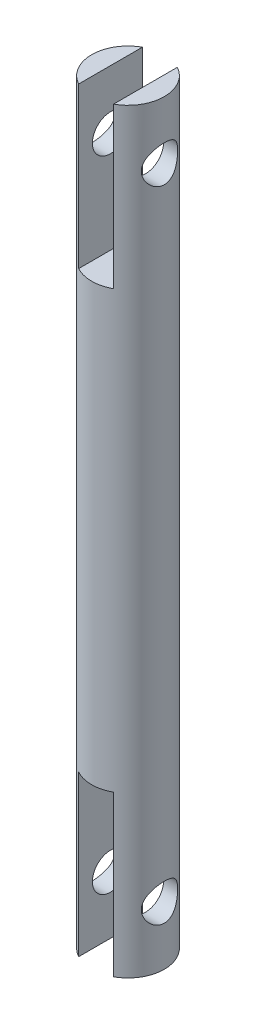
ISO-10303-21;
HEADER;
FILE_DESCRIPTION(('STEP AP214'),'2;1');
FILE_NAME('part.step','',(''),(''),'','','');
FILE_SCHEMA(('AUTOMOTIVE_DESIGN { 1 0 10303 214 1 1 1 1 }'));
ENDSEC;
DATA;
#1=APPLICATION_CONTEXT('core data for automotive mechanical design processes');
#2=APPLICATION_PROTOCOL_DEFINITION('international standard','automotive_design',2000,#1);
#3=PRODUCT_CONTEXT('',#1,'mechanical');
#4=PRODUCT('Part','Part','',(#3));
#5=PRODUCT_RELATED_PRODUCT_CATEGORY('part','',(#4));
#6=PRODUCT_DEFINITION_FORMATION('','',#4);
#7=PRODUCT_DEFINITION_CONTEXT('part definition',#1,'design');
#8=PRODUCT_DEFINITION('design','',#6,#7);
#9=PRODUCT_DEFINITION_SHAPE('','',#8);
#10=(LENGTH_UNIT() NAMED_UNIT(*) SI_UNIT(.MILLI.,.METRE.));
#11=(NAMED_UNIT(*) PLANE_ANGLE_UNIT() SI_UNIT($,.RADIAN.));
#12=(NAMED_UNIT(*) SI_UNIT($,.STERADIAN.) SOLID_ANGLE_UNIT());
#13=UNCERTAINTY_MEASURE_WITH_UNIT(LENGTH_MEASURE(1.E-05),#10,'distance_accuracy_value','');
#14=(GEOMETRIC_REPRESENTATION_CONTEXT(3) GLOBAL_UNCERTAINTY_ASSIGNED_CONTEXT((#13)) GLOBAL_UNIT_ASSIGNED_CONTEXT((#10,
#11,#12)) REPRESENTATION_CONTEXT('',''));
#15=CARTESIAN_POINT('',(0.,0.,0.));
#16=DIRECTION('',(0.,0.,1.));
#17=DIRECTION('',(1.,0.,0.));
#18=AXIS2_PLACEMENT_3D('',#15,#16,#17);
#19=CARTESIAN_POINT('',(0.,52.,0.));
#20=DIRECTION('',(0.,1.,0.));
#21=DIRECTION('',(0.,0.,1.));
#22=AXIS2_PLACEMENT_3D('',#19,#20,#21);
#23=PLANE('',#22);
#24=DIRECTION('',(0.,0.,1.));
#25=VECTOR('',#24,1.);
#26=CARTESIAN_POINT('',(-1.2,52.,-2.5));
#27=LINE('',#26,#25);
#28=CARTESIAN_POINT('',(-1.2,52.,-2.19317121994613));
#29=VERTEX_POINT('',#28);
#30=CARTESIAN_POINT('',(-1.2,52.,2.19317121994613));
#31=VERTEX_POINT('',#30);
#32=EDGE_CURVE('E116',#29,#31,#27,.T.);
#33=ORIENTED_EDGE('',*,*,#32,.F.);
#34=CARTESIAN_POINT('',(0.,52.,0.));
#35=DIRECTION('',(0.,1.,0.));
#36=DIRECTION('',(0.,0.,1.));
#37=AXIS2_PLACEMENT_3D('',#34,#35,#36);
#38=CIRCLE('',#37,2.5);
#39=EDGE_CURVE('E121',#29,#31,#38,.T.);
#40=ORIENTED_EDGE('',*,*,#39,.T.);
#41=EDGE_LOOP('',(#33,#40));
#42=FACE_BOUND('',#41,.T.);
#43=ADVANCED_FACE('F43',(#42),#23,.T.);
#44=CARTESIAN_POINT('',(-2.5,48.,0.));
#45=DIRECTION('',(1.,0.,0.));
#46=DIRECTION('',(0.,0.,-1.));
#47=AXIS2_PLACEMENT_3D('',#44,#45,#46);
#48=CYLINDRICAL_SURFACE('',#47,1.25);
#49=CARTESIAN_POINT('',(-1.2,48.,0.));
#50=DIRECTION('',(-1.,0.,0.));
#51=DIRECTION('',(0.,0.,1.));
#52=AXIS2_PLACEMENT_3D('',#49,#50,#51);
#53=CIRCLE('',#52,1.25);
#54=CARTESIAN_POINT('',(-1.2,48.,1.25));
#55=VERTEX_POINT('',#54);
#56=EDGE_CURVE('E128',#55,#55,#53,.F.);
#57=ORIENTED_EDGE('',*,*,#56,.T.);
#58=EDGE_LOOP('',(#57));
#59=FACE_BOUND('',#58,.T.);
#60=CARTESIAN_POINT('',(-2.5,46.75,0.));
#61=CARTESIAN_POINT('',(-2.49999641755189,46.7500041278994,-0.0657149536912329));
#62=CARTESIAN_POINT('',(-2.49738113774397,46.7552125914021,-0.131508249622541));
#63=CARTESIAN_POINT('',(-2.48717695046745,46.7758161004261,-0.261150294085531));
#64=CARTESIAN_POINT('',(-2.47957859786229,46.7912304912471,-0.324995108391879));
#65=CARTESIAN_POINT('',(-2.46020349254139,46.831492260771,-0.448666931100718));
#66=CARTESIAN_POINT('',(-2.448442989719,46.85630298031,-0.508508503673975));
#67=CARTESIAN_POINT('',(-2.42182220644723,46.9144632767062,-0.623090771008206));
#68=CARTESIAN_POINT('',(-2.40696217041913,46.9478121803111,-0.677831867487562));
#69=CARTESIAN_POINT('',(-2.37445322822571,47.0243965618566,-0.784384772202396));
#70=CARTESIAN_POINT('',(-2.3566899890942,47.0681080990496,-0.835819013902634));
#71=CARTESIAN_POINT('',(-2.32074962808431,47.1631518490588,-0.930974306083716));
#72=CARTESIAN_POINT('',(-2.30257220261294,47.2144898147155,-0.974689478883455));
#73=CARTESIAN_POINT('',(-2.26623688996684,47.3281041869042,-1.05656500056285));
#74=CARTESIAN_POINT('',(-2.24818983712665,47.3909201229324,-1.09403166943955));
#75=CARTESIAN_POINT('',(-2.21607473465401,47.5229591699828,-1.15771028361337));
#76=CARTESIAN_POINT('',(-2.20200384508737,47.5921776609034,-1.18393026870792));
#77=CARTESIAN_POINT('',(-2.18072333797261,47.7308313817774,-1.22266555273573));
#78=CARTESIAN_POINT('',(-2.17315339479642,47.8000055650842,-1.23590732135055));
#79=CARTESIAN_POINT('',(-2.1647736243566,47.9399735472244,-1.25053374163606));
#80=CARTESIAN_POINT('',(-2.1639571167911,48.0107656760889,-1.25193011046634));
#81=CARTESIAN_POINT('',(-2.16888662821561,48.1428575303942,-1.24335910896537));
#82=CARTESIAN_POINT('',(-2.17385954577517,48.2042800390288,-1.23473069942102));
#83=CARTESIAN_POINT('',(-2.18845285917313,48.3246523867163,-1.20867481132116));
#84=CARTESIAN_POINT('',(-2.1980747353972,48.3836014316316,-1.19124452987206));
#85=CARTESIAN_POINT('',(-2.22109345515926,48.4990364157071,-1.1477622254825));
#86=CARTESIAN_POINT('',(-2.23457300829998,48.5554329984822,-1.12151883389499));
#87=CARTESIAN_POINT('',(-2.26379255351755,48.6632928657375,-1.061302109585));
#88=CARTESIAN_POINT('',(-2.27953355975238,48.7147539195001,-1.02732530476558));
#89=CARTESIAN_POINT('',(-2.31391447379107,48.818151565929,-0.947582568640984));
#90=CARTESIAN_POINT('',(-2.33266887795933,48.8693210919702,-0.9008680729616));
#91=CARTESIAN_POINT('',(-2.36934529125509,48.9634192732386,-0.799444473426714));
#92=CARTESIAN_POINT('',(-2.38726689948501,49.0063439900424,-0.744731570717854));
#93=CARTESIAN_POINT('',(-2.42127484103705,49.0846070762872,-0.625645632289809));
#94=CARTESIAN_POINT('',(-2.43723730202509,49.1195005905572,-0.56094198949926));
#95=CARTESIAN_POINT('',(-2.46447351401553,49.1776212863038,-0.425582769360996));
#96=CARTESIAN_POINT('',(-2.47575098679441,49.200857731269,-0.354931970331595));
#97=CARTESIAN_POINT('',(-2.49155417176795,49.2330942546458,-0.215958114575876));
#98=CARTESIAN_POINT('',(-2.4965617287664,49.2431140446835,-0.147926913185405));
#99=CARTESIAN_POINT('',(-2.50091266823877,49.2518309139181,-0.0109744999366913));
#100=CARTESIAN_POINT('',(-2.5002587340164,49.2505333570493,0.0579462748373776));
#101=CARTESIAN_POINT('',(-2.49363990316801,49.2372416394766,0.189041214982493));
#102=CARTESIAN_POINT('',(-2.48809057110237,49.2260843340875,0.251324260062444));
#103=CARTESIAN_POINT('',(-2.47277714143524,49.1947024101311,0.373008615377397));
#104=CARTESIAN_POINT('',(-2.46301257917916,49.1744767919333,0.432409607113746));
#105=CARTESIAN_POINT('',(-2.43980314267087,49.1250019169585,0.548610760562083));
#106=CARTESIAN_POINT('',(-2.42626102212424,49.095511187354,0.605287996257694));
#107=CARTESIAN_POINT('',(-2.39679967896386,49.0286155804424,0.713076702123653));
#108=CARTESIAN_POINT('',(-2.38087944457231,48.9912073317582,0.764185787219102));
#109=CARTESIAN_POINT('',(-2.34635276671831,48.9052994683339,0.864709611613315));
#110=CARTESIAN_POINT('',(-2.32763606060552,48.856071414433,0.913465097280797));
#111=CARTESIAN_POINT('',(-2.29077989504843,48.7500935609134,1.00232040139155));
#112=CARTESIAN_POINT('',(-2.27264084226908,48.6933386014795,1.04241423211355));
#113=CARTESIAN_POINT('',(-2.23813990282585,48.5704454322496,1.11463489312212));
#114=CARTESIAN_POINT('',(-2.2219066207934,48.5039859172393,1.14628186984829));
#115=CARTESIAN_POINT('',(-2.19467590460158,48.3656124153843,1.19760353251725));
#116=CARTESIAN_POINT('',(-2.18367172800773,48.2937055918735,1.21729364485946));
#117=CARTESIAN_POINT('',(-2.16951876260834,48.1538622214232,1.2423271093121));
#118=CARTESIAN_POINT('',(-2.16571729325614,48.0862071832137,1.24886624550108));
#119=CARTESIAN_POINT('',(-2.16456693307719,47.9506911660366,1.25086144297598));
#120=CARTESIAN_POINT('',(-2.16721524534441,47.8828302890757,1.2463223082805));
#121=CARTESIAN_POINT('',(-2.17797327562531,47.755645623085,1.22740765699033));
#122=CARTESIAN_POINT('',(-2.18553868102992,47.6961244123195,1.2140103929285));
#123=CARTESIAN_POINT('',(-2.20463770234897,47.5802398507191,1.1789691977808));
#124=CARTESIAN_POINT('',(-2.21617259462095,47.523877522385,1.15732261394976));
#125=CARTESIAN_POINT('',(-2.2428566295566,47.4117189362667,1.10476968162585));
#126=CARTESIAN_POINT('',(-2.25819652995238,47.3562151227129,1.07333892227057));
#127=CARTESIAN_POINT('',(-2.29044164543238,47.2509068297743,1.00268871454579));
#128=CARTESIAN_POINT('',(-2.30734767243153,47.2011053368519,0.963465214048306));
#129=CARTESIAN_POINT('',(-2.34327903949141,47.102322522053,0.872754158330797));
#130=CARTESIAN_POINT('',(-2.36231229139336,47.0541761220476,0.820355528762708));
#131=CARTESIAN_POINT('',(-2.3984719031886,46.9671712707205,0.707693507775343));
#132=CARTESIAN_POINT('',(-2.4155972326005,46.9283178257171,0.647425904070976));
#133=CARTESIAN_POINT('',(-2.44622511981379,46.8609545465472,0.519914496024928));
#134=CARTESIAN_POINT('',(-2.45970120703636,46.8325197882357,0.452624379918262));
#135=CARTESIAN_POINT('',(-2.48126676704332,46.7877397901013,0.313427626617734));
#136=CARTESIAN_POINT('',(-2.48937154216165,46.771360191463,0.241534749528954));
#137=CARTESIAN_POINT('',(-2.49619327387079,46.7576282361552,0.140752433104227));
#138=CARTESIAN_POINT('',(-2.49761706674002,46.7547716989205,0.112702349299371));
#139=CARTESIAN_POINT('',(-2.49952121222331,46.750956668104,0.0564396647589457));
#140=CARTESIAN_POINT('',(-2.50000153879704,46.749998226911,0.0282270595592261));
#141=CARTESIAN_POINT('',(-2.5,46.75,0.));
#142=B_SPLINE_CURVE_WITH_KNOTS('',3,(#60,#61,#62,#63,#64,#65,#66,#67,#68,#69,#70,#71,#72,#73,
#74,#75,#76,#77,#78,#79,#80,#81,#82,#83,#84,#85,#86,#87,#88,#89,#90,#91,#92,#93,#94,#95,#96,#97,
#98,#99,#100,#101,#102,#103,#104,#105,#106,#107,#108,#109,#110,#111,#112,#113,#114,#115,#116,
#117,#118,#119,#120,#121,#122,#123,#124,#125,#126,#127,#128,#129,#130,#131,#132,#133,#134,#135,
#136,#137,#138,#139,#140,#141),.UNSPECIFIED.,.T.,.F.,(4,2,2,2,2,2,2,2,2,2,2,2,2,2,2,2,2,2,2,2,2,
2,2,2,2,2,2,2,2,2,2,2,2,2,2,2,2,2,2,2,4),(0.,0.197030321775365,0.394435187136497,
0.591077694365375,0.787704700726956,0.9962271983976,1.20490779706754,1.42977158038441,
1.65447434872851,1.86572515175287,2.07676696661275,2.2625714051165,2.44843504907097,
2.63862800210609,2.82890651575277,3.04331176667347,3.25781918248357,3.4822877776805,
3.70657771140349,3.91229113089181,4.11790705639344,4.30758633132651,4.49728652038664,
4.69241070034873,4.88761813435423,5.10199513305522,5.31651985769288,5.54143352699591,
5.76605639925971,5.96911634372966,6.17208824825005,6.35572412805227,6.53941910979597,
6.73545570969517,6.93159451423696,7.15156553440622,7.37165479220715,7.59330017078655,
7.81431135781161,7.8989410017212,7.98357298143557),.UNSPECIFIED.);
#143=CARTESIAN_POINT('',(-2.5,46.75,0.));
#144=VERTEX_POINT('',#143);
#145=EDGE_CURVE('E182',#144,#144,#142,.T.);
#146=ORIENTED_EDGE('',*,*,#145,.F.);
#147=EDGE_LOOP('',(#146));
#148=FACE_BOUND('',#147,.T.);
#149=ADVANCED_FACE('F171',(#59,#148),#48,.F.);
#150=CARTESIAN_POINT('',(0.,52.,0.));
#151=DIRECTION('',(0.,-1.,0.));
#152=DIRECTION('',(0.,0.,-1.));
#153=AXIS2_PLACEMENT_3D('',#150,#151,#152);
#154=CYLINDRICAL_SURFACE('',#153,2.5);
#155=CARTESIAN_POINT('',(0.,41.,0.));
#156=DIRECTION('',(0.,-1.,0.));
#157=DIRECTION('',(0.,0.,-1.));
#158=AXIS2_PLACEMENT_3D('',#155,#156,#157);
#159=CIRCLE('',#158,2.5);
#160=CARTESIAN_POINT('',(1.2,41.,2.19317121994613));
#161=VERTEX_POINT('',#160);
#162=CARTESIAN_POINT('',(-1.2,41.,2.19317121994613));
#163=VERTEX_POINT('',#162);
#164=EDGE_CURVE('E11',#161,#163,#159,.T.);
#165=ORIENTED_EDGE('',*,*,#164,.T.);
#166=DIRECTION('',(0.,-1.,0.));
#167=VECTOR('',#166,1.);
#168=CARTESIAN_POINT('',(-1.2,52.,2.19317121994613));
#169=LINE('',#168,#167);
#170=EDGE_CURVE('E135',#163,#31,#169,.F.);
#171=ORIENTED_EDGE('',*,*,#170,.T.);
#172=ORIENTED_EDGE('',*,*,#39,.F.);
#173=DIRECTION('',(0.,-1.,0.));
#174=VECTOR('',#173,1.);
#175=CARTESIAN_POINT('',(-1.2,52.,-2.19317121994613));
#176=LINE('',#175,#174);
#177=CARTESIAN_POINT('',(-1.2,41.,-2.19317121994613));
#178=VERTEX_POINT('',#177);
#179=EDGE_CURVE('E137',#29,#178,#176,.T.);
#180=ORIENTED_EDGE('',*,*,#179,.T.);
#181=CARTESIAN_POINT('',(1.2,41.,-2.19317121994613));
#182=VERTEX_POINT('',#181);
#183=EDGE_CURVE('E48',#178,#182,#159,.T.);
#184=ORIENTED_EDGE('',*,*,#183,.T.);
#185=DIRECTION('',(0.,-1.,0.));
#186=VECTOR('',#185,1.);
#187=CARTESIAN_POINT('',(1.2,52.,-2.19317121994613));
#188=LINE('',#187,#186);
#189=CARTESIAN_POINT('',(1.2,52.,-2.19317121994613));
#190=VERTEX_POINT('',#189);
#191=EDGE_CURVE('E110',#182,#190,#188,.F.);
#192=ORIENTED_EDGE('',*,*,#191,.T.);
#193=CARTESIAN_POINT('',(1.2,52.,2.19317121994613));
#194=VERTEX_POINT('',#193);
#195=EDGE_CURVE('E118',#194,#190,#38,.T.);
#196=ORIENTED_EDGE('',*,*,#195,.F.);
#197=DIRECTION('',(0.,-1.,0.));
#198=VECTOR('',#197,1.);
#199=CARTESIAN_POINT('',(1.2,52.,2.19317121994613));
#200=LINE('',#199,#198);
#201=EDGE_CURVE('E113',#194,#161,#200,.T.);
#202=ORIENTED_EDGE('',*,*,#201,.T.);
#203=EDGE_LOOP('',(#165,#171,#172,#180,#184,#192,#196,#202));
#204=FACE_BOUND('',#203,.T.);
#205=CARTESIAN_POINT('',(-2.5,2.75,0.));
#206=CARTESIAN_POINT('',(-2.49999641755189,2.75000412789938,-0.0657149536912331));
#207=CARTESIAN_POINT('',(-2.49738113774397,2.75521259140209,-0.131508249622541));
#208=CARTESIAN_POINT('',(-2.48717695046745,2.77581610042615,-0.261150294085532));
#209=CARTESIAN_POINT('',(-2.47957859786229,2.79123049124706,-0.32499510839188));
#210=CARTESIAN_POINT('',(-2.46020349254139,2.83149226077099,-0.448666931100718));
#211=CARTESIAN_POINT('',(-2.448442989719,2.85630298031002,-0.508508503673975));
#212=CARTESIAN_POINT('',(-2.42182220644723,2.91446327670618,-0.623090771008207));
#213=CARTESIAN_POINT('',(-2.40696217041912,2.94781218031107,-0.677831867487563));
#214=CARTESIAN_POINT('',(-2.37445322822571,3.02439656185662,-0.784384772202399));
#215=CARTESIAN_POINT('',(-2.3566899890942,3.06810809904955,-0.835819013902641));
#216=CARTESIAN_POINT('',(-2.3207496280843,3.16315184905879,-0.930974306083722));
#217=CARTESIAN_POINT('',(-2.30257220261294,3.21448981471555,-0.974689478883458));
#218=CARTESIAN_POINT('',(-2.26623688996684,3.32810418690423,-1.05656500056285));
#219=CARTESIAN_POINT('',(-2.24818983712665,3.39092012293239,-1.09403166943955));
#220=CARTESIAN_POINT('',(-2.21607473465401,3.52295916998277,-1.15771028361337));
#221=CARTESIAN_POINT('',(-2.20200384508737,3.59217766090344,-1.18393026870792));
#222=CARTESIAN_POINT('',(-2.18072333797261,3.7308313817774,-1.22266555273573));
#223=CARTESIAN_POINT('',(-2.17315339479642,3.80000556508424,-1.23590732135055));
#224=CARTESIAN_POINT('',(-2.1647736243566,3.93997354722434,-1.25053374163606));
#225=CARTESIAN_POINT('',(-2.1639571167911,4.01076567608894,-1.25193011046634));
#226=CARTESIAN_POINT('',(-2.16888662821561,4.14285753039421,-1.24335910896537));
#227=CARTESIAN_POINT('',(-2.17385954577517,4.20428003902881,-1.23473069942103));
#228=CARTESIAN_POINT('',(-2.18845285917313,4.3246523867163,-1.20867481132117));
#229=CARTESIAN_POINT('',(-2.1980747353972,4.38360143163164,-1.19124452987206));
#230=CARTESIAN_POINT('',(-2.22109345515926,4.49903641570707,-1.1477622254825));
#231=CARTESIAN_POINT('',(-2.23457300829998,4.55543299848223,-1.12151883389499));
#232=CARTESIAN_POINT('',(-2.26379255351755,4.66329286573751,-1.061302109585));
#233=CARTESIAN_POINT('',(-2.27953355975238,4.71475391950011,-1.02732530476558));
#234=CARTESIAN_POINT('',(-2.31391447379107,4.81815156592903,-0.947582568640986));
#235=CARTESIAN_POINT('',(-2.33266887795933,4.8693210919702,-0.900868072961602));
#236=CARTESIAN_POINT('',(-2.36934529125509,4.96341927323863,-0.799444473426716));
#237=CARTESIAN_POINT('',(-2.38726689948501,5.00634399004235,-0.744731570717856));
#238=CARTESIAN_POINT('',(-2.42127484103705,5.08460707628716,-0.625645632289809));
#239=CARTESIAN_POINT('',(-2.43723730202509,5.11950059055718,-0.56094198949926));
#240=CARTESIAN_POINT('',(-2.46447351401553,5.17762128630376,-0.425582769360995));
#241=CARTESIAN_POINT('',(-2.47575098679441,5.20085773126896,-0.354931970331594));
#242=CARTESIAN_POINT('',(-2.49155417176795,5.23309425464584,-0.215958114575876));
#243=CARTESIAN_POINT('',(-2.4965617287664,5.24311404468347,-0.147926913185404));
#244=CARTESIAN_POINT('',(-2.50091266823877,5.25183091391811,-0.0109744999366911));
#245=CARTESIAN_POINT('',(-2.5002587340164,5.25053335704935,0.0579462748373775));
#246=CARTESIAN_POINT('',(-2.49363990316801,5.23724163947656,0.189041214982492));
#247=CARTESIAN_POINT('',(-2.48809057110237,5.22608433408746,0.251324260062443));
#248=CARTESIAN_POINT('',(-2.47277714143524,5.19470241013114,0.373008615377396));
#249=CARTESIAN_POINT('',(-2.46301257917916,5.1744767919333,0.432409607113746));
#250=CARTESIAN_POINT('',(-2.43980314267087,5.12500191695853,0.548610760562081));
#251=CARTESIAN_POINT('',(-2.42626102212424,5.09551118735398,0.605287996257691));
#252=CARTESIAN_POINT('',(-2.39679967896386,5.02861558044245,0.71307670212365));
#253=CARTESIAN_POINT('',(-2.38087944457231,4.99120733175821,0.764185787219102));
#254=CARTESIAN_POINT('',(-2.34635276671831,4.90529946833391,0.864709611613316));
#255=CARTESIAN_POINT('',(-2.32763606060552,4.85607141443304,0.913465097280798));
#256=CARTESIAN_POINT('',(-2.29077989504843,4.75009356091337,1.00232040139155));
#257=CARTESIAN_POINT('',(-2.27264084226908,4.69333860147953,1.04241423211355));
#258=CARTESIAN_POINT('',(-2.23813990282585,4.57044543224961,1.11463489312212));
#259=CARTESIAN_POINT('',(-2.2219066207934,4.50398591723926,1.1462818698483));
#260=CARTESIAN_POINT('',(-2.19467590460158,4.36561241538435,1.19760353251725));
#261=CARTESIAN_POINT('',(-2.18367172800773,4.29370559187352,1.21729364485946));
#262=CARTESIAN_POINT('',(-2.16951876260833,4.15386222142319,1.2423271093121));
#263=CARTESIAN_POINT('',(-2.16571729325614,4.0862071832137,1.24886624550108));
#264=CARTESIAN_POINT('',(-2.16456693307719,3.95069116603659,1.25086144297598));
#265=CARTESIAN_POINT('',(-2.16721524534441,3.88283028907571,1.2463223082805));
#266=CARTESIAN_POINT('',(-2.17797327562531,3.75564562308498,1.22740765699033));
#267=CARTESIAN_POINT('',(-2.18553868102992,3.6961244123195,1.2140103929285));
#268=CARTESIAN_POINT('',(-2.20463770234897,3.58023985071912,1.17896919778081));
#269=CARTESIAN_POINT('',(-2.21617259462095,3.52387752238504,1.15732261394976));
#270=CARTESIAN_POINT('',(-2.2428566295566,3.41171893626674,1.10476968162585));
#271=CARTESIAN_POINT('',(-2.25819652995238,3.35621512271287,1.07333892227057));
#272=CARTESIAN_POINT('',(-2.29044164543238,3.25090682977427,1.00268871454579));
#273=CARTESIAN_POINT('',(-2.30734767243153,3.20110533685189,0.963465214048309));
#274=CARTESIAN_POINT('',(-2.34327903949141,3.10232252205298,0.8727541583308));
#275=CARTESIAN_POINT('',(-2.36231229139336,3.0541761220476,0.820355528762712));
#276=CARTESIAN_POINT('',(-2.3984719031886,2.96717127072046,0.707693507775348));
#277=CARTESIAN_POINT('',(-2.4155972326005,2.92831782571714,0.64742590407098));
#278=CARTESIAN_POINT('',(-2.44622511981379,2.86095454654725,0.519914496024933));
#279=CARTESIAN_POINT('',(-2.45970120703636,2.83251978823571,0.452624379918268));
#280=CARTESIAN_POINT('',(-2.48126676704332,2.78773979010131,0.313427626617739));
#281=CARTESIAN_POINT('',(-2.48937154216165,2.77136019146303,0.241534749528957));
#282=CARTESIAN_POINT('',(-2.49619327387079,2.75762823615519,0.140752433104229));
#283=CARTESIAN_POINT('',(-2.49761706674002,2.75477169892048,0.112702349299373));
#284=CARTESIAN_POINT('',(-2.49952121222331,2.75095666810399,0.0564396647589469));
#285=CARTESIAN_POINT('',(-2.50000153879704,2.749998226911,0.0282270595592267));
#286=CARTESIAN_POINT('',(-2.5,2.75,0.));
#287=B_SPLINE_CURVE_WITH_KNOTS('',3,(#205,#206,#207,#208,#209,#210,#211,#212,#213,#214,#215,
#216,#217,#218,#219,#220,#221,#222,#223,#224,#225,#226,#227,#228,#229,#230,#231,#232,#233,#234,
#235,#236,#237,#238,#239,#240,#241,#242,#243,#244,#245,#246,#247,#248,#249,#250,#251,#252,#253,
#254,#255,#256,#257,#258,#259,#260,#261,#262,#263,#264,#265,#266,#267,#268,#269,#270,#271,#272,
#273,#274,#275,#276,#277,#278,#279,#280,#281,#282,#283,#284,#285,#286),.UNSPECIFIED.,.T.,.F.,(4,
2,2,2,2,2,2,2,2,2,2,2,2,2,2,2,2,2,2,2,2,2,2,2,2,2,2,2,2,2,2,2,2,2,2,2,2,2,2,2,4),(0.,
0.197030321775366,0.394435187136497,0.591077694365373,0.78770470072696,0.996227198397612,
1.20490779706755,1.42977158038441,1.65447434872851,1.86572515175287,2.07676696661275,
2.2625714051165,2.44843504907098,2.63862800210609,2.82890651575277,3.04331176667348,
3.25781918248358,3.48228777768051,3.70657771140349,3.91229113089182,4.11790705639345,
4.30758633132652,4.49728652038664,4.69241070034873,4.88761813435424,5.10199513305523,
5.31651985769289,5.54143352699592,5.76605639925972,5.96911634372967,6.17208824825007,
6.35572412805228,6.53941910979597,6.73545570969517,6.93159451423697,7.15156553440623,
7.37165479220716,7.59330017078656,7.81431135781162,7.89894100172122,7.98357298143558),.UNSPECIFIED.);
#288=CARTESIAN_POINT('',(-2.5,2.75,0.));
#289=VERTEX_POINT('',#288);
#290=EDGE_CURVE('E150',#289,#289,#287,.T.);
#291=ORIENTED_EDGE('',*,*,#290,.T.);
#292=EDGE_LOOP('',(#291));
#293=FACE_BOUND('',#292,.T.);
#294=CARTESIAN_POINT('',(2.1650635094611,4.,-1.25));
#295=CARTESIAN_POINT('',(2.16506918410574,3.93486523975594,-1.24999545384316));
#296=CARTESIAN_POINT('',(2.16804751484696,3.86964823559369,-1.24487496341652));
#297=CARTESIAN_POINT('',(2.17952958065066,3.74121591915356,-1.22465401237257));
#298=CARTESIAN_POINT('',(2.18804492569449,3.67800510619574,-1.20953258069272));
#299=CARTESIAN_POINT('',(2.20936683256748,3.55568541957007,-1.17012493587476));
#300=CARTESIAN_POINT('',(2.22215054341565,3.49655668440802,-1.14588744061716));
#301=CARTESIAN_POINT('',(2.25053331021072,3.3832197475041,-1.08908440672047));
#302=CARTESIAN_POINT('',(2.26613251845081,3.32901181217193,-1.05651841754472));
#303=CARTESIAN_POINT('',(2.29996086321802,3.22211783930312,-0.980833175663599));
#304=CARTESIAN_POINT('',(2.31830079547442,3.16992608040807,-0.937065045179714));
#305=CARTESIAN_POINT('',(2.35464978482132,3.07323951449162,-0.841567259518087));
#306=CARTESIAN_POINT('',(2.37265867289062,3.0287485467706,-0.789833657227868));
#307=CARTESIAN_POINT('',(2.40776846191186,2.94579106106542,-0.675611954268185));
#308=CARTESIAN_POINT('',(2.42472633022716,2.90793279017559,-0.612633986265721));
#309=CARTESIAN_POINT('',(2.45438445124411,2.8435739334428,-0.480196283249383));
#310=CARTESIAN_POINT('',(2.46708738979677,2.81706617982854,-0.410740672672698));
#311=CARTESIAN_POINT('',(2.48600576555297,2.77811917337363,-0.272556179907475));
#312=CARTESIAN_POINT('',(2.49261850276115,2.76481309205559,-0.204127238111026));
#313=CARTESIAN_POINT('',(2.50009479807584,2.7497923516562,-0.0657132858723139));
#314=CARTESIAN_POINT('',(2.50096183480737,2.74807067900536,0.00427075730466945));
#315=CARTESIAN_POINT('',(2.49703727395563,2.75593334246294,0.137290655529684));
#316=CARTESIAN_POINT('',(2.49273119865201,2.76454751940153,0.200401498970986));
#317=CARTESIAN_POINT('',(2.47967806574684,2.79110105488082,0.3241422148979));
#318=CARTESIAN_POINT('',(2.47093067582992,2.80904111122028,0.384771901367404));
#319=CARTESIAN_POINT('',(2.44964479109568,2.85385320761227,0.50288673946194));
#320=CARTESIAN_POINT('',(2.43705551911499,2.88084539146508,0.560316779393971));
#321=CARTESIAN_POINT('',(2.40922057483359,2.94282927025187,0.669971001891658));
#322=CARTESIAN_POINT('',(2.39397395196855,2.97782382912794,0.722193311048305));
#323=CARTESIAN_POINT('',(2.36055492999037,3.05861918941627,0.825217076122742));
#324=CARTESIAN_POINT('',(2.34224219997719,3.10512878540751,0.875417593786699));
#325=CARTESIAN_POINT('',(2.30567925733515,3.20573715616272,0.967630462872223));
#326=CARTESIAN_POINT('',(2.28742910332036,3.25984171534258,1.00963651446779));
#327=CARTESIAN_POINT('',(2.25180195115606,3.37831024053011,1.08688166830276));
#328=CARTESIAN_POINT('',(2.23455399988385,3.44310752881776,1.12152164372256));
#329=CARTESIAN_POINT('',(2.2046931284822,3.57867208919875,1.17914889125154));
#330=CARTESIAN_POINT('',(2.19207537557584,3.64943304127195,1.20214832276361));
#331=CARTESIAN_POINT('',(2.17430794771293,3.78901813910349,1.2339752637813));
#332=CARTESIAN_POINT('',(2.16864569810621,3.85755139880444,1.24378140264997));
#333=CARTESIAN_POINT('',(2.16397399202012,3.99550167689567,1.25189618326428));
#334=CARTESIAN_POINT('',(2.1649598361164,4.06491803639973,1.25021294664378));
#335=CARTESIAN_POINT('',(2.17292920675731,4.19456739822341,1.23629505417996));
#336=CARTESIAN_POINT('',(2.17924484383318,4.2549743138849,1.22523477089058));
#337=CARTESIAN_POINT('',(2.19617526939176,4.37295973283869,1.19462035579055));
#338=CARTESIAN_POINT('',(2.20679145006292,4.43053731343326,1.17506347327952));
#339=CARTESIAN_POINT('',(2.23170277599571,4.54426416362837,1.12705948575611));
#340=CARTESIAN_POINT('',(2.24614554053829,4.60022377106694,1.09824257961591));
#341=CARTESIAN_POINT('',(2.27695149371562,4.70683658942374,1.03285883001976));
#342=CARTESIAN_POINT('',(2.29331566693934,4.7574870543916,0.996288005415272));
#343=CARTESIAN_POINT('',(2.3285999807042,4.85872345940443,0.911046458998569));
#344=CARTESIAN_POINT('',(2.34758228942861,4.90849643839707,0.86143159039371));
#345=CARTESIAN_POINT('',(2.38417793722366,4.99926529749199,0.754255619247862));
#346=CARTESIAN_POINT('',(2.40179081259637,5.04025821278817,0.696691843319186));
#347=CARTESIAN_POINT('',(2.43426702113696,5.11321715743763,0.573169203198449));
#348=CARTESIAN_POINT('',(2.44904552090036,5.14491639776364,0.507028871967643));
#349=CARTESIAN_POINT('',(2.47354193699126,5.19642237982174,0.369402955801354));
#350=CARTESIAN_POINT('',(2.48326429595466,5.21623956420788,0.297922126740222));
#351=CARTESIAN_POINT('',(2.49584385227353,5.24171070521833,0.158724602913023));
#352=CARTESIAN_POINT('',(2.49924909885239,5.24849734484514,0.0912643048130729));
#353=CARTESIAN_POINT('',(2.50052662968914,5.251054081818,-0.0439074824390028));
#354=CARTESIAN_POINT('',(2.49840085083612,5.24682803565445,-0.111618875368857));
#355=CARTESIAN_POINT('',(2.48917461047403,5.22822949150547,-0.240672490396432));
#356=CARTESIAN_POINT('',(2.48241118334987,5.21454393842791,-0.302140397264078));
#357=CARTESIAN_POINT('',(2.46490117079279,5.17834125087129,-0.42180744022952));
#358=CARTESIAN_POINT('',(2.45415401415995,5.15582284988318,-0.480006106194384));
#359=CARTESIAN_POINT('',(2.4290741343515,5.10159118479253,-0.594279257806103));
#360=CARTESIAN_POINT('',(2.41460771498499,5.0695258459902,-0.650156428375055));
#361=CARTESIAN_POINT('',(2.38360166427283,4.99755258642619,-0.755968302267528));
#362=CARTESIAN_POINT('',(2.36706108197951,4.95764106360541,-0.805900259268631));
#363=CARTESIAN_POINT('',(2.33160762783285,4.86650357622162,-0.903642505196111));
#364=CARTESIAN_POINT('',(2.31262248764623,4.81454689065351,-0.950747105674087));
#365=CARTESIAN_POINT('',(2.27578845203566,4.70318659858779,-1.03582910924334));
#366=CARTESIAN_POINT('',(2.25794057202332,4.6437764739154,-1.07379843751257));
#367=CARTESIAN_POINT('',(2.22499506631145,4.51670419177381,-1.14053884973207));
#368=CARTESIAN_POINT('',(2.21000217820338,4.44884058608908,-1.16898133245117));
#369=CARTESIAN_POINT('',(2.1858269541044,4.30833449457528,-1.21359838688301));
#370=CARTESIAN_POINT('',(2.17662520184628,4.23570888885914,-1.22981398896918));
#371=CARTESIAN_POINT('',(2.16911590752238,4.13524330543501,-1.24295875983052));
#372=CARTESIAN_POINT('',(2.1676016125644,4.10829013200265,-1.24559513120481));
#373=CARTESIAN_POINT('',(2.16557419859688,4.0542293991472,-1.24911675636245));
#374=CARTESIAN_POINT('',(2.16506114656387,4.02712182951766,-1.25000189299984));
#375=CARTESIAN_POINT('',(2.1650635094611,4.,-1.25));
#376=B_SPLINE_CURVE_WITH_KNOTS('',3,(#294,#295,#296,#297,#298,#299,#300,#301,#302,#303,#304,
#305,#306,#307,#308,#309,#310,#311,#312,#313,#314,#315,#316,#317,#318,#319,#320,#321,#322,#323,
#324,#325,#326,#327,#328,#329,#330,#331,#332,#333,#334,#335,#336,#337,#338,#339,#340,#341,#342,
#343,#344,#345,#346,#347,#348,#349,#350,#351,#352,#353,#354,#355,#356,#357,#358,#359,#360,#361,
#362,#363,#364,#365,#366,#367,#368,#369,#370,#371,#372,#373,#374,#375),.UNSPECIFIED.,.T.,.F.,(4,
2,2,2,2,2,2,2,2,2,2,2,2,2,2,2,2,2,2,2,2,2,2,2,2,2,2,2,2,2,2,2,2,2,2,2,2,2,2,2,4),(0.,
0.195290153243394,0.390991116031005,0.585660744898606,0.780340906806435,0.991077890622789,
1.20191963855463,1.42697365298454,1.65188533704863,1.86079356209918,2.0695752960755,
2.26020121855672,2.45084140646818,2.64411918413933,2.83746624187839,3.04908989321113,
3.26087560307398,3.4861105216181,3.71110967764631,3.91827863567764,4.12530116485466,
4.30967729280031,4.49411315545078,4.68709120507609,4.88016857775058,5.09758429475766,
5.31507331222752,5.53830226766206,5.76133474760964,5.96390337986858,6.16640108492464,
6.35555531089365,6.54473666890015,6.74200938399339,6.93937287625898,7.15637802312583,
7.37357428556442,7.59763436298255,7.8209391625345,7.90225168981636,7.98356965618175),.UNSPECIFIED.);
#377=CARTESIAN_POINT('',(2.1650635094611,4.,-1.25));
#378=VERTEX_POINT('',#377);
#379=EDGE_CURVE('E143',#378,#378,#376,.T.);
#380=ORIENTED_EDGE('',*,*,#379,.T.);
#381=EDGE_LOOP('',(#380));
#382=FACE_BOUND('',#381,.T.);
#383=ORIENTED_EDGE('',*,*,#145,.T.);
#384=EDGE_LOOP('',(#383));
#385=FACE_BOUND('',#384,.T.);
#386=CARTESIAN_POINT('',(2.1650635094611,48.,-1.25));
#387=CARTESIAN_POINT('',(2.16506918410574,47.9348652397559,-1.24999545384316));
#388=CARTESIAN_POINT('',(2.16804751484696,47.8696482355937,-1.24487496341652));
#389=CARTESIAN_POINT('',(2.17952958065066,47.7412159191536,-1.22465401237257));
#390=CARTESIAN_POINT('',(2.18804492569449,47.6780051061957,-1.20953258069272));
#391=CARTESIAN_POINT('',(2.20936683256748,47.5556854195701,-1.17012493587476));
#392=CARTESIAN_POINT('',(2.22215054341565,47.496556684408,-1.14588744061716));
#393=CARTESIAN_POINT('',(2.25053331021072,47.3832197475041,-1.08908440672046));
#394=CARTESIAN_POINT('',(2.26613251845081,47.3290118121719,-1.05651841754471));
#395=CARTESIAN_POINT('',(2.29996086321802,47.2221178393031,-0.980833175663595));
#396=CARTESIAN_POINT('',(2.31830079547442,47.1699260804081,-0.93706504517971));
#397=CARTESIAN_POINT('',(2.35464978482132,47.0732395144916,-0.841567259518083));
#398=CARTESIAN_POINT('',(2.37265867289062,47.0287485467706,-0.789833657227865));
#399=CARTESIAN_POINT('',(2.40776846191186,46.9457910610654,-0.675611954268183));
#400=CARTESIAN_POINT('',(2.42472633022716,46.9079327901756,-0.61263398626572));
#401=CARTESIAN_POINT('',(2.45438445124411,46.8435739334428,-0.480196283249383));
#402=CARTESIAN_POINT('',(2.46708738979677,46.8170661798285,-0.410740672672697));
#403=CARTESIAN_POINT('',(2.48600576555297,46.7781191733736,-0.272556179907475));
#404=CARTESIAN_POINT('',(2.49261850276115,46.7648130920556,-0.204127238111025));
#405=CARTESIAN_POINT('',(2.50009479807584,46.7497923516562,-0.0657132858723139));
#406=CARTESIAN_POINT('',(2.50096183480737,46.7480706790054,0.00427075730466915));
#407=CARTESIAN_POINT('',(2.49703727395563,46.7559333424629,0.137290655529684));
#408=CARTESIAN_POINT('',(2.49273119865201,46.7645475194015,0.200401498970986));
#409=CARTESIAN_POINT('',(2.47967806574684,46.7911010548808,0.3241422148979));
#410=CARTESIAN_POINT('',(2.47093067582992,46.8090411112203,0.384771901367404));
#411=CARTESIAN_POINT('',(2.44964479109568,46.8538532076123,0.502886739461939));
#412=CARTESIAN_POINT('',(2.43705551911499,46.8808453914651,0.56031677939397));
#413=CARTESIAN_POINT('',(2.40922057483359,46.9428292702519,0.669971001891658));
#414=CARTESIAN_POINT('',(2.39397395196855,46.9778238291279,0.722193311048306));
#415=CARTESIAN_POINT('',(2.36055492999037,47.0586191894163,0.825217076122743));
#416=CARTESIAN_POINT('',(2.34224219997719,47.1051287854075,0.875417593786699));
#417=CARTESIAN_POINT('',(2.30567925733515,47.2057371561627,0.967630462872223));
#418=CARTESIAN_POINT('',(2.28742910332036,47.2598417153426,1.00963651446779));
#419=CARTESIAN_POINT('',(2.25180195115606,47.3783102405301,1.08688166830276));
#420=CARTESIAN_POINT('',(2.23455399988384,47.4431075288178,1.12152164372256));
#421=CARTESIAN_POINT('',(2.2046931284822,47.5786720891987,1.17914889125154));
#422=CARTESIAN_POINT('',(2.19207537557584,47.649433041272,1.20214832276361));
#423=CARTESIAN_POINT('',(2.17430794771293,47.7890181391035,1.2339752637813));
#424=CARTESIAN_POINT('',(2.16864569810621,47.8575513988044,1.24378140264997));
#425=CARTESIAN_POINT('',(2.16397399202012,47.9955016768957,1.25189618326428));
#426=CARTESIAN_POINT('',(2.1649598361164,48.0649180363997,1.25021294664378));
#427=CARTESIAN_POINT('',(2.17292920675731,48.1945673982234,1.23629505417996));
#428=CARTESIAN_POINT('',(2.17924484383318,48.2549743138849,1.22523477089058));
#429=CARTESIAN_POINT('',(2.19617526939176,48.3729597328387,1.19462035579055));
#430=CARTESIAN_POINT('',(2.20679145006292,48.4305373134333,1.17506347327952));
#431=CARTESIAN_POINT('',(2.23170277599571,48.5442641636284,1.12705948575611));
#432=CARTESIAN_POINT('',(2.24614554053829,48.6002237710669,1.0982425796159));
#433=CARTESIAN_POINT('',(2.27695149371562,48.7068365894237,1.03285883001976));
#434=CARTESIAN_POINT('',(2.29331566693934,48.7574870543916,0.996288005415271));
#435=CARTESIAN_POINT('',(2.3285999807042,48.8587234594044,0.911046458998568));
#436=CARTESIAN_POINT('',(2.34758228942861,48.9084964383971,0.86143159039371));
#437=CARTESIAN_POINT('',(2.38417793722365,48.999265297492,0.754255619247864));
#438=CARTESIAN_POINT('',(2.40179081259636,49.0402582127882,0.696691843319187));
#439=CARTESIAN_POINT('',(2.43426702113696,49.1132171574376,0.57316920319845));
#440=CARTESIAN_POINT('',(2.44904552090036,49.1449163977636,0.507028871967644));
#441=CARTESIAN_POINT('',(2.47354193699126,49.1964223798217,0.369402955801354));
#442=CARTESIAN_POINT('',(2.48326429595466,49.2162395642079,0.29792212674022));
#443=CARTESIAN_POINT('',(2.49584385227353,49.2417107052183,0.158724602913021));
#444=CARTESIAN_POINT('',(2.49924909885239,49.2484973448451,0.0912643048130715));
#445=CARTESIAN_POINT('',(2.50052662968914,49.251054081818,-0.0439074824390033));
#446=CARTESIAN_POINT('',(2.49840085083612,49.2468280356545,-0.111618875368857));
#447=CARTESIAN_POINT('',(2.48917461047403,49.2282294915055,-0.240672490396431));
#448=CARTESIAN_POINT('',(2.48241118334987,49.2145439384279,-0.302140397264077));
#449=CARTESIAN_POINT('',(2.46490117079279,49.1783412508713,-0.421807440229519));
#450=CARTESIAN_POINT('',(2.45415401415995,49.1558228498832,-0.480006106194384));
#451=CARTESIAN_POINT('',(2.4290741343515,49.1015911847925,-0.594279257806104));
#452=CARTESIAN_POINT('',(2.41460771498499,49.0695258459902,-0.650156428375056));
#453=CARTESIAN_POINT('',(2.38360166427283,48.9975525864262,-0.75596830226753));
#454=CARTESIAN_POINT('',(2.36706108197951,48.9576410636054,-0.805900259268633));
#455=CARTESIAN_POINT('',(2.33160762783285,48.8665035762216,-0.903642505196114));
#456=CARTESIAN_POINT('',(2.31262248764622,48.8145468906535,-0.95074710567409));
#457=CARTESIAN_POINT('',(2.27578845203565,48.7031865985878,-1.03582910924334));
#458=CARTESIAN_POINT('',(2.25794057202332,48.6437764739154,-1.07379843751257));
#459=CARTESIAN_POINT('',(2.22499506631145,48.5167041917738,-1.14053884973207));
#460=CARTESIAN_POINT('',(2.21000217820338,48.4488405860891,-1.16898133245117));
#461=CARTESIAN_POINT('',(2.1858269541044,48.3083344945753,-1.21359838688301));
#462=CARTESIAN_POINT('',(2.17662520184628,48.2357088888591,-1.22981398896918));
#463=CARTESIAN_POINT('',(2.16911590752238,48.135243305435,-1.24295875983052));
#464=CARTESIAN_POINT('',(2.1676016125644,48.1082901320026,-1.24559513120481));
#465=CARTESIAN_POINT('',(2.16557419859688,48.0542293991472,-1.24911675636245));
#466=CARTESIAN_POINT('',(2.16506114656387,48.0271218295177,-1.25000189299984));
#467=CARTESIAN_POINT('',(2.1650635094611,48.,-1.25));
#468=B_SPLINE_CURVE_WITH_KNOTS('',3,(#386,#387,#388,#389,#390,#391,#392,#393,#394,#395,#396,
#397,#398,#399,#400,#401,#402,#403,#404,#405,#406,#407,#408,#409,#410,#411,#412,#413,#414,#415,
#416,#417,#418,#419,#420,#421,#422,#423,#424,#425,#426,#427,#428,#429,#430,#431,#432,#433,#434,
#435,#436,#437,#438,#439,#440,#441,#442,#443,#444,#445,#446,#447,#448,#449,#450,#451,#452,#453,
#454,#455,#456,#457,#458,#459,#460,#461,#462,#463,#464,#465,#466,#467),.UNSPECIFIED.,.T.,.F.,(4,
2,2,2,2,2,2,2,2,2,2,2,2,2,2,2,2,2,2,2,2,2,2,2,2,2,2,2,2,2,2,2,2,2,2,2,2,2,2,2,4),(0.,
0.195290153243387,0.390991116031004,0.585660744898612,0.780340906806441,0.991077890622794,
1.20191963855463,1.42697365298454,1.65188533704863,1.86079356209918,2.06957529607549,
2.26020121855672,2.45084140646818,2.64411918413933,2.83746624187839,3.04908989321113,
3.26087560307398,3.4861105216181,3.71110967764631,3.91827863567763,4.12530116485465,
4.30967729280031,4.49411315545078,4.68709120507608,4.88016857775058,5.09758429475765,
5.31507331222751,5.53830226766206,5.76133474760963,5.96390337986857,6.16640108492463,
6.35555531089364,6.54473666890015,6.74200938399339,6.93937287625898,7.15637802312583,
7.37357428556441,7.59763436298255,7.82093916253449,7.90225168981636,7.98356965618174),.UNSPECIFIED.);
#469=CARTESIAN_POINT('',(2.1650635094611,48.,-1.25));
#470=VERTEX_POINT('',#469);
#471=EDGE_CURVE('E176',#470,#470,#468,.T.);
#472=ORIENTED_EDGE('',*,*,#471,.T.);
#473=EDGE_LOOP('',(#472));
#474=FACE_BOUND('',#473,.T.);
#475=DIRECTION('',(0.,-1.,0.));
#476=VECTOR('',#475,1.);
#477=CARTESIAN_POINT('',(-1.2,52.,2.19317121994613));
#478=LINE('',#477,#476);
#479=CARTESIAN_POINT('',(-1.2,11.,2.19317121994613));
#480=VERTEX_POINT('',#479);
#481=CARTESIAN_POINT('',(-1.2,0.,2.19317121994613));
#482=VERTEX_POINT('',#481);
#483=EDGE_CURVE('E209',#480,#482,#478,.T.);
#484=ORIENTED_EDGE('',*,*,#483,.F.);
#485=CARTESIAN_POINT('',(0.,11.,0.));
#486=DIRECTION('',(0.,-1.,0.));
#487=DIRECTION('',(0.,0.,-1.));
#488=AXIS2_PLACEMENT_3D('',#485,#486,#487);
#489=CIRCLE('',#488,2.5);
#490=CARTESIAN_POINT('',(1.2,11.,2.19317121994613));
#491=VERTEX_POINT('',#490);
#492=EDGE_CURVE('E218',#491,#480,#489,.T.);
#493=ORIENTED_EDGE('',*,*,#492,.F.);
#494=DIRECTION('',(0.,-1.,0.));
#495=VECTOR('',#494,1.);
#496=CARTESIAN_POINT('',(1.2,52.,2.19317121994613));
#497=LINE('',#496,#495);
#498=CARTESIAN_POINT('',(1.2,0.,2.19317121994613));
#499=VERTEX_POINT('',#498);
#500=EDGE_CURVE('E247',#491,#499,#497,.T.);
#501=ORIENTED_EDGE('',*,*,#500,.T.);
#502=CARTESIAN_POINT('',(0.,0.,0.));
#503=DIRECTION('',(0.,1.,0.));
#504=DIRECTION('',(0.,0.,1.));
#505=AXIS2_PLACEMENT_3D('',#502,#503,#504);
#506=CIRCLE('',#505,2.5);
#507=CARTESIAN_POINT('',(1.2,0.,-2.19317121994613));
#508=VERTEX_POINT('',#507);
#509=EDGE_CURVE('E204',#499,#508,#506,.T.);
#510=ORIENTED_EDGE('',*,*,#509,.T.);
#511=DIRECTION('',(0.,-1.,0.));
#512=VECTOR('',#511,1.);
#513=CARTESIAN_POINT('',(1.2,52.,-2.19317121994613));
#514=LINE('',#513,#512);
#515=CARTESIAN_POINT('',(1.2,11.,-2.19317121994613));
#516=VERTEX_POINT('',#515);
#517=EDGE_CURVE('E249',#508,#516,#514,.F.);
#518=ORIENTED_EDGE('',*,*,#517,.T.);
#519=CARTESIAN_POINT('',(-1.2,11.,-2.19317121994613));
#520=VERTEX_POINT('',#519);
#521=EDGE_CURVE('E216',#520,#516,#489,.T.);
#522=ORIENTED_EDGE('',*,*,#521,.F.);
#523=DIRECTION('',(0.,-1.,0.));
#524=VECTOR('',#523,1.);
#525=CARTESIAN_POINT('',(-1.2,52.,-2.19317121994613));
#526=LINE('',#525,#524);
#527=CARTESIAN_POINT('',(-1.2,0.,-2.19317121994613));
#528=VERTEX_POINT('',#527);
#529=EDGE_CURVE('E245',#528,#520,#526,.F.);
#530=ORIENTED_EDGE('',*,*,#529,.F.);
#531=EDGE_CURVE('E206',#528,#482,#506,.T.);
#532=ORIENTED_EDGE('',*,*,#531,.T.);
#533=EDGE_LOOP('',(#484,#493,#501,#510,#518,#522,#530,#532));
#534=FACE_BOUND('',#533,.T.);
#535=ADVANCED_FACE('F45',(#204,#293,#382,#385,#474,#534),#154,.T.);
#536=CARTESIAN_POINT('',(0.,0.,0.));
#537=DIRECTION('',(0.,1.,0.));
#538=DIRECTION('',(0.,0.,1.));
#539=AXIS2_PLACEMENT_3D('',#536,#537,#538);
#540=PLANE('',#539);
#541=DIRECTION('',(0.,0.,-1.));
#542=VECTOR('',#541,1.);
#543=CARTESIAN_POINT('',(-1.2,0.,0.));
#544=LINE('',#543,#542);
#545=EDGE_CURVE('E214',#482,#528,#544,.T.);
#546=ORIENTED_EDGE('',*,*,#545,.F.);
#547=ORIENTED_EDGE('',*,*,#531,.F.);
#548=EDGE_LOOP('',(#546,#547));
#549=FACE_BOUND('',#548,.T.);
#550=ADVANCED_FACE('F231',(#549),#540,.F.);
#551=DIRECTION('',(0.,0.,-1.));
#552=VECTOR('',#551,1.);
#553=CARTESIAN_POINT('',(1.2,52.,-2.5));
#554=LINE('',#553,#552);
#555=EDGE_CURVE('E58',#194,#190,#554,.T.);
#556=ORIENTED_EDGE('',*,*,#555,.F.);
#557=ORIENTED_EDGE('',*,*,#195,.T.);
#558=EDGE_LOOP('',(#556,#557));
#559=FACE_BOUND('',#558,.T.);
#560=ADVANCED_FACE('F119',(#559),#23,.T.);
#561=ORIENTED_EDGE('',*,*,#509,.F.);
#562=DIRECTION('',(0.,0.,-1.));
#563=VECTOR('',#562,1.);
#564=CARTESIAN_POINT('',(1.2,0.,0.));
#565=LINE('',#564,#563);
#566=EDGE_CURVE('E65',#499,#508,#565,.T.);
#567=ORIENTED_EDGE('',*,*,#566,.T.);
#568=EDGE_LOOP('',(#561,#567));
#569=FACE_BOUND('',#568,.T.);
#570=ADVANCED_FACE('F261',(#569),#540,.F.);
#571=CARTESIAN_POINT('',(0.,11.,0.));
#572=DIRECTION('',(0.,-1.,0.));
#573=DIRECTION('',(0.,0.,-1.));
#574=AXIS2_PLACEMENT_3D('',#571,#572,#573);
#575=PLANE('',#574);
#576=DIRECTION('',(0.,0.,1.));
#577=VECTOR('',#576,1.);
#578=CARTESIAN_POINT('',(1.2,11.,-2.5));
#579=LINE('',#578,#577);
#580=EDGE_CURVE('E255',#516,#491,#579,.T.);
#581=ORIENTED_EDGE('',*,*,#580,.T.);
#582=ORIENTED_EDGE('',*,*,#492,.T.);
#583=DIRECTION('',(0.,0.,1.));
#584=VECTOR('',#583,1.);
#585=CARTESIAN_POINT('',(-1.2,11.,-2.5));
#586=LINE('',#585,#584);
#587=EDGE_CURVE('E254',#520,#480,#586,.T.);
#588=ORIENTED_EDGE('',*,*,#587,.F.);
#589=ORIENTED_EDGE('',*,*,#521,.T.);
#590=EDGE_LOOP('',(#581,#582,#588,#589));
#591=FACE_BOUND('',#590,.T.);
#592=ADVANCED_FACE('F172',(#591),#575,.T.);
#593=CARTESIAN_POINT('',(-1.2,11.,-2.5));
#594=DIRECTION('',(1.,0.,0.));
#595=DIRECTION('',(0.,0.,-1.));
#596=AXIS2_PLACEMENT_3D('',#593,#594,#595);
#597=PLANE('',#596);
#598=CARTESIAN_POINT('',(-1.2,4.,0.));
#599=DIRECTION('',(1.,0.,0.));
#600=DIRECTION('',(0.,0.,-1.));
#601=AXIS2_PLACEMENT_3D('',#598,#599,#600);
#602=CIRCLE('',#601,1.25);
#603=CARTESIAN_POINT('',(-1.2,4.,-1.25));
#604=VERTEX_POINT('',#603);
#605=EDGE_CURVE('E140',#604,#604,#602,.T.);
#606=ORIENTED_EDGE('',*,*,#605,.F.);
#607=EDGE_LOOP('',(#606));
#608=FACE_BOUND('',#607,.T.);
#609=ORIENTED_EDGE('',*,*,#483,.T.);
#610=ORIENTED_EDGE('',*,*,#545,.T.);
#611=ORIENTED_EDGE('',*,*,#529,.T.);
#612=ORIENTED_EDGE('',*,*,#587,.T.);
#613=EDGE_LOOP('',(#609,#610,#611,#612));
#614=FACE_BOUND('',#613,.T.);
#615=ADVANCED_FACE('F267',(#608,#614),#597,.T.);
#616=CARTESIAN_POINT('',(1.2,11.,-2.5));
#617=DIRECTION('',(1.,0.,0.));
#618=DIRECTION('',(0.,0.,-1.));
#619=AXIS2_PLACEMENT_3D('',#616,#617,#618);
#620=PLANE('',#619);
#621=CARTESIAN_POINT('',(1.2,4.,0.));
#622=DIRECTION('',(1.,0.,0.));
#623=DIRECTION('',(0.,0.,-1.));
#624=AXIS2_PLACEMENT_3D('',#621,#622,#623);
#625=CIRCLE('',#624,1.25);
#626=CARTESIAN_POINT('',(1.2,4.,-1.25));
#627=VERTEX_POINT('',#626);
#628=EDGE_CURVE('E139',#627,#627,#625,.T.);
#629=ORIENTED_EDGE('',*,*,#628,.T.);
#630=EDGE_LOOP('',(#629));
#631=FACE_BOUND('',#630,.T.);
#632=ORIENTED_EDGE('',*,*,#580,.F.);
#633=ORIENTED_EDGE('',*,*,#517,.F.);
#634=ORIENTED_EDGE('',*,*,#566,.F.);
#635=ORIENTED_EDGE('',*,*,#500,.F.);
#636=EDGE_LOOP('',(#632,#633,#634,#635));
#637=FACE_BOUND('',#636,.T.);
#638=ADVANCED_FACE('F222',(#631,#637),#620,.F.);
#639=CARTESIAN_POINT('',(-2.5,4.,0.));
#640=DIRECTION('',(1.,0.,0.));
#641=DIRECTION('',(0.,0.,-1.));
#642=AXIS2_PLACEMENT_3D('',#639,#640,#641);
#643=CYLINDRICAL_SURFACE('',#642,1.25);
#644=ORIENTED_EDGE('',*,*,#628,.F.);
#645=EDGE_LOOP('',(#644));
#646=FACE_BOUND('',#645,.T.);
#647=ORIENTED_EDGE('',*,*,#379,.F.);
#648=EDGE_LOOP('',(#647));
#649=FACE_BOUND('',#648,.T.);
#650=ADVANCED_FACE('F161',(#646,#649),#643,.F.);
#651=ORIENTED_EDGE('',*,*,#605,.T.);
#652=EDGE_LOOP('',(#651));
#653=FACE_BOUND('',#652,.T.);
#654=ORIENTED_EDGE('',*,*,#290,.F.);
#655=EDGE_LOOP('',(#654));
#656=FACE_BOUND('',#655,.T.);
#657=ADVANCED_FACE('F155',(#653,#656),#643,.F.);
#658=CARTESIAN_POINT('',(1.2,48.,0.));
#659=DIRECTION('',(1.,0.,0.));
#660=DIRECTION('',(0.,0.,-1.));
#661=AXIS2_PLACEMENT_3D('',#658,#659,#660);
#662=CIRCLE('',#661,1.25);
#663=CARTESIAN_POINT('',(1.2,48.,-1.25));
#664=VERTEX_POINT('',#663);
#665=EDGE_CURVE('E126',#664,#664,#662,.F.);
#666=ORIENTED_EDGE('',*,*,#665,.T.);
#667=EDGE_LOOP('',(#666));
#668=FACE_BOUND('',#667,.T.);
#669=ORIENTED_EDGE('',*,*,#471,.F.);
#670=EDGE_LOOP('',(#669));
#671=FACE_BOUND('',#670,.T.);
#672=ADVANCED_FACE('F160',(#668,#671),#48,.F.);
#673=CARTESIAN_POINT('',(0.,41.,0.));
#674=DIRECTION('',(0.,-1.,0.));
#675=DIRECTION('',(0.,0.,-1.));
#676=AXIS2_PLACEMENT_3D('',#673,#674,#675);
#677=PLANE('',#676);
#678=DIRECTION('',(0.,0.,-1.));
#679=VECTOR('',#678,1.);
#680=CARTESIAN_POINT('',(1.2,41.,-2.5));
#681=LINE('',#680,#679);
#682=EDGE_CURVE('E131',#161,#182,#681,.T.);
#683=ORIENTED_EDGE('',*,*,#682,.T.);
#684=ORIENTED_EDGE('',*,*,#183,.F.);
#685=DIRECTION('',(0.,0.,1.));
#686=VECTOR('',#685,1.);
#687=CARTESIAN_POINT('',(-1.2,41.,-2.5));
#688=LINE('',#687,#686);
#689=EDGE_CURVE('E115',#178,#163,#688,.T.);
#690=ORIENTED_EDGE('',*,*,#689,.T.);
#691=ORIENTED_EDGE('',*,*,#164,.F.);
#692=EDGE_LOOP('',(#683,#684,#690,#691));
#693=FACE_BOUND('',#692,.T.);
#694=ADVANCED_FACE('F169',(#693),#677,.F.);
#695=CARTESIAN_POINT('',(-1.2,41.,-2.5));
#696=DIRECTION('',(-1.,0.,0.));
#697=DIRECTION('',(0.,0.,1.));
#698=AXIS2_PLACEMENT_3D('',#695,#696,#697);
#699=PLANE('',#698);
#700=ORIENTED_EDGE('',*,*,#56,.F.);
#701=EDGE_LOOP('',(#700));
#702=FACE_BOUND('',#701,.T.);
#703=ORIENTED_EDGE('',*,*,#32,.T.);
#704=ORIENTED_EDGE('',*,*,#170,.F.);
#705=ORIENTED_EDGE('',*,*,#689,.F.);
#706=ORIENTED_EDGE('',*,*,#179,.F.);
#707=EDGE_LOOP('',(#703,#704,#705,#706));
#708=FACE_BOUND('',#707,.T.);
#709=ADVANCED_FACE('F163',(#702,#708),#699,.F.);
#710=CARTESIAN_POINT('',(1.2,41.,-2.5));
#711=DIRECTION('',(1.,0.,0.));
#712=DIRECTION('',(0.,0.,-1.));
#713=AXIS2_PLACEMENT_3D('',#710,#711,#712);
#714=PLANE('',#713);
#715=ORIENTED_EDGE('',*,*,#665,.F.);
#716=EDGE_LOOP('',(#715));
#717=FACE_BOUND('',#716,.T.);
#718=ORIENTED_EDGE('',*,*,#555,.T.);
#719=ORIENTED_EDGE('',*,*,#191,.F.);
#720=ORIENTED_EDGE('',*,*,#682,.F.);
#721=ORIENTED_EDGE('',*,*,#201,.F.);
#722=EDGE_LOOP('',(#718,#719,#720,#721));
#723=FACE_BOUND('',#722,.T.);
#724=ADVANCED_FACE('F108',(#717,#723),#714,.F.);
#725=CLOSED_SHELL('',(#43,#149,#535,#550,#560,#570,#592,#615,#638,#650,#657,#672,#694,#709,#724));
#726=MANIFOLD_SOLID_BREP('B2',#725);
#727=ADVANCED_BREP_SHAPE_REPRESENTATION('',(#18,#726),#14);
#728=SHAPE_DEFINITION_REPRESENTATION(#9,#727);
ENDSEC;
END-ISO-10303-21;
